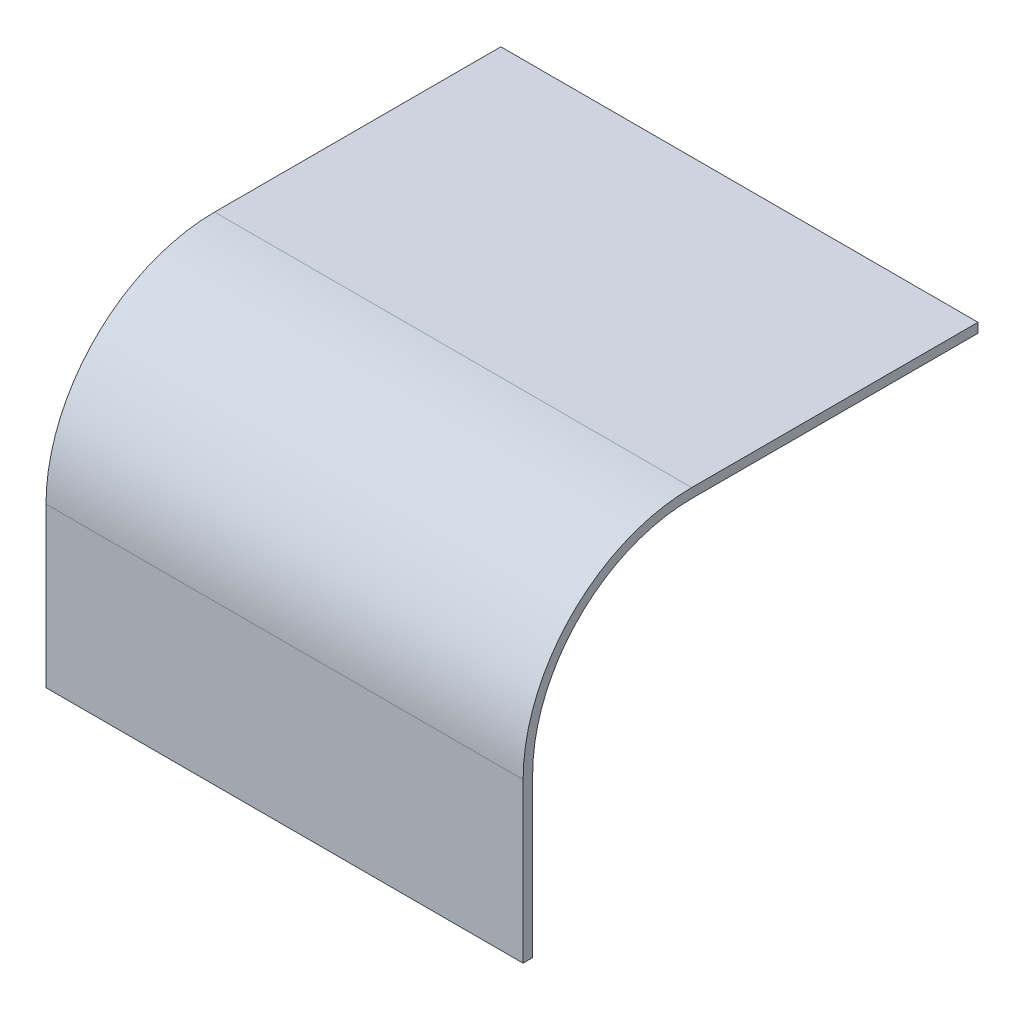
ISO-10303-21;
HEADER;
FILE_DESCRIPTION(('STEP AP214'),'2;1');
FILE_NAME('part.step','',(''),(''),'','','');
FILE_SCHEMA(('AUTOMOTIVE_DESIGN { 1 0 10303 214 1 1 1 1 }'));
ENDSEC;
DATA;
#1=APPLICATION_CONTEXT('core data for automotive mechanical design processes');
#2=APPLICATION_PROTOCOL_DEFINITION('international standard','automotive_design',2000,#1);
#3=PRODUCT_CONTEXT('',#1,'mechanical');
#4=PRODUCT('Part','Part','',(#3));
#5=PRODUCT_RELATED_PRODUCT_CATEGORY('part','',(#4));
#6=PRODUCT_DEFINITION_FORMATION('','',#4);
#7=PRODUCT_DEFINITION_CONTEXT('part definition',#1,'design');
#8=PRODUCT_DEFINITION('design','',#6,#7);
#9=PRODUCT_DEFINITION_SHAPE('','',#8);
#10=(LENGTH_UNIT() NAMED_UNIT(*) SI_UNIT(.MILLI.,.METRE.));
#11=(NAMED_UNIT(*) PLANE_ANGLE_UNIT() SI_UNIT($,.RADIAN.));
#12=(NAMED_UNIT(*) SI_UNIT($,.STERADIAN.) SOLID_ANGLE_UNIT());
#13=UNCERTAINTY_MEASURE_WITH_UNIT(LENGTH_MEASURE(1.E-05),#10,'distance_accuracy_value','');
#14=(GEOMETRIC_REPRESENTATION_CONTEXT(3) GLOBAL_UNCERTAINTY_ASSIGNED_CONTEXT((#13)) GLOBAL_UNIT_ASSIGNED_CONTEXT((#10,
#11,#12)) REPRESENTATION_CONTEXT('',''));
#15=CARTESIAN_POINT('',(0.,0.,0.));
#16=DIRECTION('',(0.,0.,1.));
#17=DIRECTION('',(1.,0.,0.));
#18=AXIS2_PLACEMENT_3D('',#15,#16,#17);
#19=CARTESIAN_POINT('',(67.6943061130725,17.5432803309073,1030.92625475085));
#20=DIRECTION('',(-1.,0.,0.));
#21=DIRECTION('',(0.,0.,1.));
#22=AXIS2_PLACEMENT_3D('',#19,#20,#21);
#23=CYLINDRICAL_SURFACE('',#22,50.);
#24=CARTESIAN_POINT('',(-82.3056938869275,17.5432803309073,1030.92625475085));
#25=DIRECTION('',(-1.,0.,0.));
#26=DIRECTION('',(0.,0.,-1.));
#27=AXIS2_PLACEMENT_3D('',#24,#25,#26);
#28=CIRCLE('',#27,50.);
#29=CARTESIAN_POINT('',(-82.3056938869275,17.5432803309073,1080.92625475085));
#30=VERTEX_POINT('',#29);
#31=CARTESIAN_POINT('',(-82.3056938869275,67.5432803309073,1030.92625475085));
#32=VERTEX_POINT('',#31);
#33=EDGE_CURVE('E134',#30,#32,#28,.T.);
#34=ORIENTED_EDGE('',*,*,#33,.T.);
#35=DIRECTION('',(-1.,0.,0.));
#36=VECTOR('',#35,1.);
#37=CARTESIAN_POINT('',(67.6943061130725,67.5432803309073,1030.92625475085));
#38=LINE('',#37,#36);
#39=CARTESIAN_POINT('',(67.6943061130725,67.5432803309073,1030.92625475085));
#40=VERTEX_POINT('',#39);
#41=EDGE_CURVE('E11',#40,#32,#38,.T.);
#42=ORIENTED_EDGE('',*,*,#41,.F.);
#43=CARTESIAN_POINT('',(67.6943061130725,17.5432803309073,1030.92625475085));
#44=DIRECTION('',(-1.,0.,0.));
#45=DIRECTION('',(0.,0.,-1.));
#46=AXIS2_PLACEMENT_3D('',#43,#44,#45);
#47=CIRCLE('',#46,50.);
#48=CARTESIAN_POINT('',(67.6943061130725,17.5432803309073,1080.92625475085));
#49=VERTEX_POINT('',#48);
#50=EDGE_CURVE('E146',#49,#40,#47,.T.);
#51=ORIENTED_EDGE('',*,*,#50,.F.);
#52=DIRECTION('',(-1.,0.,0.));
#53=VECTOR('',#52,1.);
#54=CARTESIAN_POINT('',(67.6943061130725,17.5432803309073,1080.92625475085));
#55=LINE('',#54,#53);
#56=EDGE_CURVE('E131',#49,#30,#55,.T.);
#57=ORIENTED_EDGE('',*,*,#56,.T.);
#58=EDGE_LOOP('',(#34,#42,#51,#57));
#59=FACE_BOUND('',#58,.T.);
#60=ADVANCED_FACE('F39',(#59),#23,.F.);
#61=CARTESIAN_POINT('',(67.6943061130725,67.5432803309073,1030.92625475085));
#62=DIRECTION('',(0.,1.,0.));
#63=DIRECTION('',(0.,0.,1.));
#64=AXIS2_PLACEMENT_3D('',#61,#62,#63);
#65=PLANE('',#64);
#66=DIRECTION('',(0.,0.,-1.));
#67=VECTOR('',#66,1.);
#68=CARTESIAN_POINT('',(-82.3056938869275,67.5432803309073,1030.92625475085));
#69=LINE('',#68,#67);
#70=CARTESIAN_POINT('',(-82.3056938869275,67.5432803309073,940.926254750851));
#71=VERTEX_POINT('',#70);
#72=EDGE_CURVE('E138',#32,#71,#69,.T.);
#73=ORIENTED_EDGE('',*,*,#72,.T.);
#74=DIRECTION('',(-1.,0.,0.));
#75=VECTOR('',#74,1.);
#76=CARTESIAN_POINT('',(67.6943061130725,67.5432803309073,940.926254750851));
#77=LINE('',#76,#75);
#78=CARTESIAN_POINT('',(67.6943061130725,67.5432803309073,940.926254750851));
#79=VERTEX_POINT('',#78);
#80=EDGE_CURVE('E50',#79,#71,#77,.T.);
#81=ORIENTED_EDGE('',*,*,#80,.F.);
#82=DIRECTION('',(0.,0.,-1.));
#83=VECTOR('',#82,1.);
#84=CARTESIAN_POINT('',(67.6943061130725,67.5432803309073,1030.92625475085));
#85=LINE('',#84,#83);
#86=EDGE_CURVE('E97',#40,#79,#85,.T.);
#87=ORIENTED_EDGE('',*,*,#86,.F.);
#88=ORIENTED_EDGE('',*,*,#41,.T.);
#89=EDGE_LOOP('',(#73,#81,#87,#88));
#90=FACE_BOUND('',#89,.T.);
#91=ADVANCED_FACE('F182',(#90),#65,.F.);
#92=CARTESIAN_POINT('',(67.6943061130725,70.5432803309073,940.926254750851));
#93=DIRECTION('',(0.,0.,1.));
#94=DIRECTION('',(1.,0.,0.));
#95=AXIS2_PLACEMENT_3D('',#92,#93,#94);
#96=PLANE('',#95);
#97=DIRECTION('',(0.,1.,0.));
#98=VECTOR('',#97,1.);
#99=CARTESIAN_POINT('',(-82.3056938869275,70.5432803309073,940.926254750851));
#100=LINE('',#99,#98);
#101=CARTESIAN_POINT('',(-82.3056938869275,70.5432803309073,940.926254750851));
#102=VERTEX_POINT('',#101);
#103=EDGE_CURVE('E139',#71,#102,#100,.T.);
#104=ORIENTED_EDGE('',*,*,#103,.T.);
#105=DIRECTION('',(-1.,0.,0.));
#106=VECTOR('',#105,1.);
#107=CARTESIAN_POINT('',(67.6943061130725,70.5432803309073,940.926254750851));
#108=LINE('',#107,#106);
#109=CARTESIAN_POINT('',(67.6943061130725,70.5432803309073,940.926254750851));
#110=VERTEX_POINT('',#109);
#111=EDGE_CURVE('E157',#110,#102,#108,.T.);
#112=ORIENTED_EDGE('',*,*,#111,.F.);
#113=DIRECTION('',(0.,1.,0.));
#114=VECTOR('',#113,1.);
#115=CARTESIAN_POINT('',(67.6943061130725,70.5432803309073,940.926254750851));
#116=LINE('',#115,#114);
#117=EDGE_CURVE('E161',#79,#110,#116,.T.);
#118=ORIENTED_EDGE('',*,*,#117,.F.);
#119=ORIENTED_EDGE('',*,*,#80,.T.);
#120=EDGE_LOOP('',(#104,#112,#118,#119));
#121=FACE_BOUND('',#120,.T.);
#122=ADVANCED_FACE('F164',(#121),#96,.F.);
#123=CARTESIAN_POINT('',(67.6943061130725,70.5432803309073,1030.92625475085));
#124=DIRECTION('',(0.,-1.,0.));
#125=DIRECTION('',(0.,0.,-1.));
#126=AXIS2_PLACEMENT_3D('',#123,#124,#125);
#127=PLANE('',#126);
#128=DIRECTION('',(0.,0.,1.));
#129=VECTOR('',#128,1.);
#130=CARTESIAN_POINT('',(-82.3056938869275,70.5432803309073,1030.92625475085));
#131=LINE('',#130,#129);
#132=CARTESIAN_POINT('',(-82.3056938869275,70.5432803309073,1030.92625475085));
#133=VERTEX_POINT('',#132);
#134=EDGE_CURVE('E145',#102,#133,#131,.T.);
#135=ORIENTED_EDGE('',*,*,#134,.T.);
#136=DIRECTION('',(-1.,0.,0.));
#137=VECTOR('',#136,1.);
#138=CARTESIAN_POINT('',(67.6943061130725,70.5432803309073,1030.92625475085));
#139=LINE('',#138,#137);
#140=CARTESIAN_POINT('',(67.6943061130725,70.5432803309073,1030.92625475085));
#141=VERTEX_POINT('',#140);
#142=EDGE_CURVE('E155',#141,#133,#139,.T.);
#143=ORIENTED_EDGE('',*,*,#142,.F.);
#144=DIRECTION('',(0.,0.,1.));
#145=VECTOR('',#144,1.);
#146=CARTESIAN_POINT('',(67.6943061130725,70.5432803309073,1030.92625475085));
#147=LINE('',#146,#145);
#148=EDGE_CURVE('E176',#110,#141,#147,.T.);
#149=ORIENTED_EDGE('',*,*,#148,.F.);
#150=ORIENTED_EDGE('',*,*,#111,.T.);
#151=EDGE_LOOP('',(#135,#143,#149,#150));
#152=FACE_BOUND('',#151,.T.);
#153=ADVANCED_FACE('F175',(#152),#127,.F.);
#154=CARTESIAN_POINT('',(67.6943061130725,17.5432803309073,1030.92625475085));
#155=DIRECTION('',(-1.,0.,0.));
#156=DIRECTION('',(0.,0.,1.));
#157=AXIS2_PLACEMENT_3D('',#154,#155,#156);
#158=CYLINDRICAL_SURFACE('',#157,53.);
#159=CARTESIAN_POINT('',(-82.3056938869275,17.5432803309073,1030.92625475085));
#160=DIRECTION('',(1.,0.,0.));
#161=DIRECTION('',(0.,0.,-1.));
#162=AXIS2_PLACEMENT_3D('',#159,#160,#161);
#163=CIRCLE('',#162,53.);
#164=CARTESIAN_POINT('',(-82.3056938869275,17.5432803309073,1083.92625475085));
#165=VERTEX_POINT('',#164);
#166=EDGE_CURVE('E143',#133,#165,#163,.T.);
#167=ORIENTED_EDGE('',*,*,#166,.T.);
#168=DIRECTION('',(-1.,0.,0.));
#169=VECTOR('',#168,1.);
#170=CARTESIAN_POINT('',(67.6943061130725,17.5432803309073,1083.92625475085));
#171=LINE('',#170,#169);
#172=CARTESIAN_POINT('',(67.6943061130725,17.5432803309073,1083.92625475085));
#173=VERTEX_POINT('',#172);
#174=EDGE_CURVE('E128',#173,#165,#171,.T.);
#175=ORIENTED_EDGE('',*,*,#174,.F.);
#176=CARTESIAN_POINT('',(67.6943061130725,17.5432803309073,1030.92625475085));
#177=DIRECTION('',(1.,0.,0.));
#178=DIRECTION('',(0.,0.,-1.));
#179=AXIS2_PLACEMENT_3D('',#176,#177,#178);
#180=CIRCLE('',#179,53.);
#181=EDGE_CURVE('E119',#141,#173,#180,.T.);
#182=ORIENTED_EDGE('',*,*,#181,.F.);
#183=ORIENTED_EDGE('',*,*,#142,.T.);
#184=EDGE_LOOP('',(#167,#175,#182,#183));
#185=FACE_BOUND('',#184,.T.);
#186=ADVANCED_FACE('F172',(#185),#158,.T.);
#187=CARTESIAN_POINT('',(67.6943061130725,-32.4567196690927,1083.92625475085));
#188=DIRECTION('',(0.,0.,-1.));
#189=DIRECTION('',(-1.,0.,0.));
#190=AXIS2_PLACEMENT_3D('',#187,#188,#189);
#191=PLANE('',#190);
#192=DIRECTION('',(0.,-1.,0.));
#193=VECTOR('',#192,1.);
#194=CARTESIAN_POINT('',(-82.3056938869275,-32.4567196690927,1083.92625475085));
#195=LINE('',#194,#193);
#196=CARTESIAN_POINT('',(-82.3056938869275,-32.4567196690927,1083.92625475085));
#197=VERTEX_POINT('',#196);
#198=EDGE_CURVE('E124',#165,#197,#195,.T.);
#199=ORIENTED_EDGE('',*,*,#198,.T.);
#200=DIRECTION('',(-1.,0.,0.));
#201=VECTOR('',#200,1.);
#202=CARTESIAN_POINT('',(67.6943061130725,-32.4567196690927,1083.92625475085));
#203=LINE('',#202,#201);
#204=CARTESIAN_POINT('',(67.6943061130725,-32.4567196690927,1083.92625475085));
#205=VERTEX_POINT('',#204);
#206=EDGE_CURVE('E122',#205,#197,#203,.T.);
#207=ORIENTED_EDGE('',*,*,#206,.F.);
#208=DIRECTION('',(0.,-1.,0.));
#209=VECTOR('',#208,1.);
#210=CARTESIAN_POINT('',(67.6943061130725,-32.4567196690927,1083.92625475085));
#211=LINE('',#210,#209);
#212=EDGE_CURVE('E112',#173,#205,#211,.T.);
#213=ORIENTED_EDGE('',*,*,#212,.F.);
#214=ORIENTED_EDGE('',*,*,#174,.T.);
#215=EDGE_LOOP('',(#199,#207,#213,#214));
#216=FACE_BOUND('',#215,.T.);
#217=ADVANCED_FACE('F121',(#216),#191,.F.);
#218=CARTESIAN_POINT('',(67.6943061130725,-32.4567196690927,1083.92625475085));
#219=DIRECTION('',(0.,1.,0.));
#220=DIRECTION('',(0.,0.,1.));
#221=AXIS2_PLACEMENT_3D('',#218,#219,#220);
#222=PLANE('',#221);
#223=DIRECTION('',(0.,0.,-1.));
#224=VECTOR('',#223,1.);
#225=CARTESIAN_POINT('',(-82.3056938869275,-32.4567196690927,1083.92625475085));
#226=LINE('',#225,#224);
#227=CARTESIAN_POINT('',(-82.3056938869275,-32.4567196690927,1080.92625475085));
#228=VERTEX_POINT('',#227);
#229=EDGE_CURVE('E84',#197,#228,#226,.T.);
#230=ORIENTED_EDGE('',*,*,#229,.T.);
#231=DIRECTION('',(-1.,0.,0.));
#232=VECTOR('',#231,1.);
#233=CARTESIAN_POINT('',(67.6943061130725,-32.4567196690927,1080.92625475085));
#234=LINE('',#233,#232);
#235=CARTESIAN_POINT('',(67.6943061130725,-32.4567196690927,1080.92625475085));
#236=VERTEX_POINT('',#235);
#237=EDGE_CURVE('E130',#236,#228,#234,.T.);
#238=ORIENTED_EDGE('',*,*,#237,.F.);
#239=DIRECTION('',(0.,0.,-1.));
#240=VECTOR('',#239,1.);
#241=CARTESIAN_POINT('',(67.6943061130725,-32.4567196690927,1083.92625475085));
#242=LINE('',#241,#240);
#243=EDGE_CURVE('E113',#205,#236,#242,.T.);
#244=ORIENTED_EDGE('',*,*,#243,.F.);
#245=ORIENTED_EDGE('',*,*,#206,.T.);
#246=EDGE_LOOP('',(#230,#238,#244,#245));
#247=FACE_BOUND('',#246,.T.);
#248=ADVANCED_FACE('F129',(#247),#222,.F.);
#249=CARTESIAN_POINT('',(67.6943061130725,-32.4567196690927,1080.92625475085));
#250=DIRECTION('',(0.,0.,1.));
#251=DIRECTION('',(1.,0.,0.));
#252=AXIS2_PLACEMENT_3D('',#249,#250,#251);
#253=PLANE('',#252);
#254=DIRECTION('',(0.,1.,0.));
#255=VECTOR('',#254,1.);
#256=CARTESIAN_POINT('',(-82.3056938869275,-32.4567196690927,1080.92625475085));
#257=LINE('',#256,#255);
#258=EDGE_CURVE('E89',#228,#30,#257,.T.);
#259=ORIENTED_EDGE('',*,*,#258,.T.);
#260=ORIENTED_EDGE('',*,*,#56,.F.);
#261=DIRECTION('',(0.,1.,0.));
#262=VECTOR('',#261,1.);
#263=CARTESIAN_POINT('',(67.6943061130725,-32.4567196690927,1080.92625475085));
#264=LINE('',#263,#262);
#265=EDGE_CURVE('E54',#236,#49,#264,.T.);
#266=ORIENTED_EDGE('',*,*,#265,.F.);
#267=ORIENTED_EDGE('',*,*,#237,.T.);
#268=EDGE_LOOP('',(#259,#260,#266,#267));
#269=FACE_BOUND('',#268,.T.);
#270=ADVANCED_FACE('F198',(#269),#253,.F.);
#271=CARTESIAN_POINT('',(67.6943061130725,17.5432803309073,1030.92625475085));
#272=DIRECTION('',(1.,0.,0.));
#273=DIRECTION('',(0.,0.,-1.));
#274=AXIS2_PLACEMENT_3D('',#271,#272,#273);
#275=PLANE('',#274);
#276=ORIENTED_EDGE('',*,*,#50,.T.);
#277=ORIENTED_EDGE('',*,*,#86,.T.);
#278=ORIENTED_EDGE('',*,*,#117,.T.);
#279=ORIENTED_EDGE('',*,*,#148,.T.);
#280=ORIENTED_EDGE('',*,*,#181,.T.);
#281=ORIENTED_EDGE('',*,*,#212,.T.);
#282=ORIENTED_EDGE('',*,*,#243,.T.);
#283=ORIENTED_EDGE('',*,*,#265,.T.);
#284=EDGE_LOOP('',(#276,#277,#278,#279,#280,#281,#282,#283));
#285=FACE_BOUND('',#284,.T.);
#286=ADVANCED_FACE('F111',(#285),#275,.T.);
#287=CARTESIAN_POINT('',(-82.3056938869275,17.5432803309073,1030.92625475085));
#288=DIRECTION('',(1.,0.,0.));
#289=DIRECTION('',(0.,0.,-1.));
#290=AXIS2_PLACEMENT_3D('',#287,#288,#289);
#291=PLANE('',#290);
#292=ORIENTED_EDGE('',*,*,#33,.F.);
#293=ORIENTED_EDGE('',*,*,#258,.F.);
#294=ORIENTED_EDGE('',*,*,#229,.F.);
#295=ORIENTED_EDGE('',*,*,#198,.F.);
#296=ORIENTED_EDGE('',*,*,#166,.F.);
#297=ORIENTED_EDGE('',*,*,#134,.F.);
#298=ORIENTED_EDGE('',*,*,#103,.F.);
#299=ORIENTED_EDGE('',*,*,#72,.F.);
#300=EDGE_LOOP('',(#292,#293,#294,#295,#296,#297,#298,#299));
#301=FACE_BOUND('',#300,.T.);
#302=ADVANCED_FACE('F166',(#301),#291,.F.);
#303=CLOSED_SHELL('',(#60,#91,#122,#153,#186,#217,#248,#270,#286,#302));
#304=MANIFOLD_SOLID_BREP('B2',#303);
#305=ADVANCED_BREP_SHAPE_REPRESENTATION('',(#18,#304),#14);
#306=SHAPE_DEFINITION_REPRESENTATION(#9,#305);
ENDSEC;
END-ISO-10303-21;
